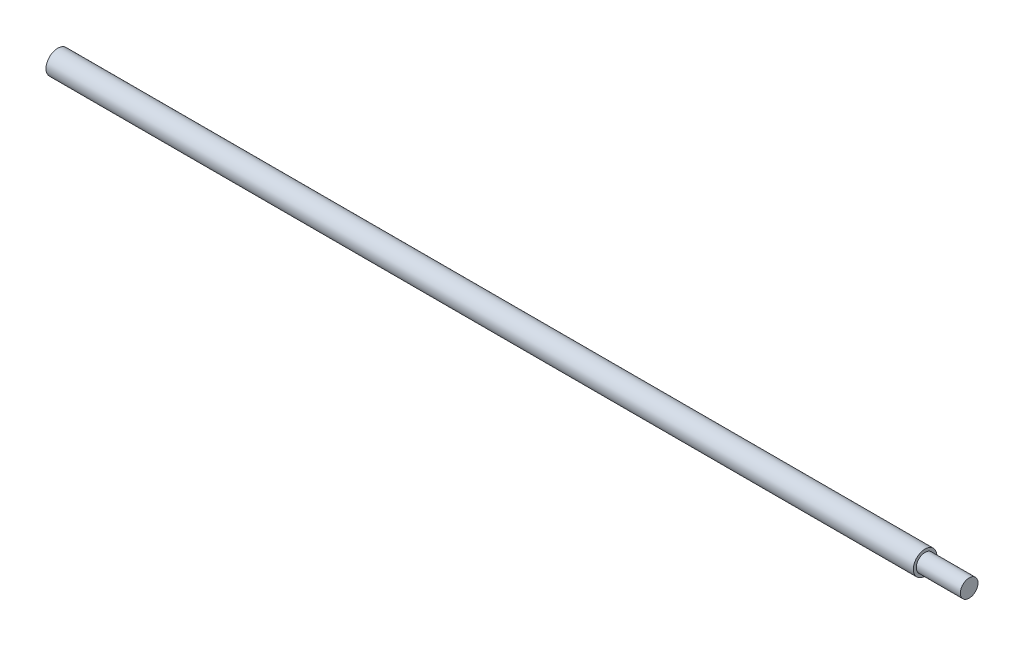
ISO-10303-21;
HEADER;
FILE_DESCRIPTION(('STEP AP214'),'2;1');
FILE_NAME('part.step','',(''),(''),'','','');
FILE_SCHEMA(('AUTOMOTIVE_DESIGN { 1 0 10303 214 1 1 1 1 }'));
ENDSEC;
DATA;
#1=APPLICATION_CONTEXT('core data for automotive mechanical design processes');
#2=APPLICATION_PROTOCOL_DEFINITION('international standard','automotive_design',2000,#1);
#3=PRODUCT_CONTEXT('',#1,'mechanical');
#4=PRODUCT('Part','Part','',(#3));
#5=PRODUCT_RELATED_PRODUCT_CATEGORY('part','',(#4));
#6=PRODUCT_DEFINITION_FORMATION('','',#4);
#7=PRODUCT_DEFINITION_CONTEXT('part definition',#1,'design');
#8=PRODUCT_DEFINITION('design','',#6,#7);
#9=PRODUCT_DEFINITION_SHAPE('','',#8);
#10=(LENGTH_UNIT() NAMED_UNIT(*) SI_UNIT(.MILLI.,.METRE.));
#11=(NAMED_UNIT(*) PLANE_ANGLE_UNIT() SI_UNIT($,.RADIAN.));
#12=(NAMED_UNIT(*) SI_UNIT($,.STERADIAN.) SOLID_ANGLE_UNIT());
#13=UNCERTAINTY_MEASURE_WITH_UNIT(LENGTH_MEASURE(1.E-05),#10,'distance_accuracy_value','');
#14=(GEOMETRIC_REPRESENTATION_CONTEXT(3) GLOBAL_UNCERTAINTY_ASSIGNED_CONTEXT((#13)) GLOBAL_UNIT_ASSIGNED_CONTEXT((#10,
#11,#12)) REPRESENTATION_CONTEXT('',''));
#15=CARTESIAN_POINT('',(0.,0.,0.));
#16=DIRECTION('',(0.,0.,1.));
#17=DIRECTION('',(1.,0.,0.));
#18=AXIS2_PLACEMENT_3D('',#15,#16,#17);
#19=CARTESIAN_POINT('',(-155.,0.,0.));
#20=DIRECTION('',(-1.,0.,0.));
#21=DIRECTION('',(0.,0.,1.));
#22=AXIS2_PLACEMENT_3D('',#19,#20,#21);
#23=PLANE('',#22);
#24=CARTESIAN_POINT('',(-155.,0.,0.));
#25=DIRECTION('',(1.,0.,0.));
#26=DIRECTION('',(0.,0.,-1.));
#27=AXIS2_PLACEMENT_3D('',#24,#25,#26);
#28=CIRCLE('',#27,3.99999999999995);
#29=CARTESIAN_POINT('',(-155.,0.,-3.99999999999995));
#30=VERTEX_POINT('',#29);
#31=EDGE_CURVE('E10',#30,#30,#28,.T.);
#32=ORIENTED_EDGE('',*,*,#31,.F.);
#33=EDGE_LOOP('',(#32));
#34=FACE_BOUND('',#33,.T.);
#35=ADVANCED_FACE('F39',(#34),#23,.T.);
#36=CARTESIAN_POINT('',(277.081919690945,0.,0.));
#37=DIRECTION('',(1.,0.,0.));
#38=DIRECTION('',(0.,0.,-1.));
#39=AXIS2_PLACEMENT_3D('',#36,#37,#38);
#40=CYLINDRICAL_SURFACE('',#39,3.99999999999995);
#41=ORIENTED_EDGE('',*,*,#31,.T.);
#42=EDGE_LOOP('',(#41));
#43=FACE_BOUND('',#42,.T.);
#44=CARTESIAN_POINT('',(140.,0.,0.));
#45=DIRECTION('',(1.,0.,0.));
#46=DIRECTION('',(0.,0.,-1.));
#47=AXIS2_PLACEMENT_3D('',#44,#45,#46);
#48=CIRCLE('',#47,3.99999999999995);
#49=CARTESIAN_POINT('',(140.,0.,-3.99999999999995));
#50=VERTEX_POINT('',#49);
#51=EDGE_CURVE('E45',#50,#50,#48,.T.);
#52=ORIENTED_EDGE('',*,*,#51,.F.);
#53=EDGE_LOOP('',(#52));
#54=FACE_BOUND('',#53,.T.);
#55=ADVANCED_FACE('F71',(#43,#54),#40,.T.);
#56=CARTESIAN_POINT('',(140.,3.99999999999995,0.));
#57=DIRECTION('',(1.,0.,0.));
#58=DIRECTION('',(0.,0.,-1.));
#59=AXIS2_PLACEMENT_3D('',#56,#57,#58);
#60=PLANE('',#59);
#61=ORIENTED_EDGE('',*,*,#51,.T.);
#62=EDGE_LOOP('',(#61));
#63=FACE_BOUND('',#62,.T.);
#64=CARTESIAN_POINT('',(140.,0.,0.));
#65=DIRECTION('',(1.,0.,0.));
#66=DIRECTION('',(0.,0.,-1.));
#67=AXIS2_PLACEMENT_3D('',#64,#65,#66);
#68=CIRCLE('',#67,2.99999999999998);
#69=CARTESIAN_POINT('',(140.,0.,-2.99999999999998));
#70=VERTEX_POINT('',#69);
#71=EDGE_CURVE('E49',#70,#70,#68,.T.);
#72=ORIENTED_EDGE('',*,*,#71,.F.);
#73=EDGE_LOOP('',(#72));
#74=FACE_BOUND('',#73,.T.);
#75=ADVANCED_FACE('F63',(#63,#74),#60,.T.);
#76=CARTESIAN_POINT('',(277.081919690945,0.,0.));
#77=DIRECTION('',(1.,0.,0.));
#78=DIRECTION('',(0.,0.,-1.));
#79=AXIS2_PLACEMENT_3D('',#76,#77,#78);
#80=CYLINDRICAL_SURFACE('',#79,2.99999999999998);
#81=ORIENTED_EDGE('',*,*,#71,.T.);
#82=EDGE_LOOP('',(#81));
#83=FACE_BOUND('',#82,.T.);
#84=CARTESIAN_POINT('',(155.,0.,0.));
#85=DIRECTION('',(1.,0.,0.));
#86=DIRECTION('',(0.,0.,-1.));
#87=AXIS2_PLACEMENT_3D('',#84,#85,#86);
#88=CIRCLE('',#87,2.99999999999998);
#89=CARTESIAN_POINT('',(155.,0.,-2.99999999999998));
#90=VERTEX_POINT('',#89);
#91=EDGE_CURVE('E53',#90,#90,#88,.T.);
#92=ORIENTED_EDGE('',*,*,#91,.F.);
#93=EDGE_LOOP('',(#92));
#94=FACE_BOUND('',#93,.T.);
#95=ADVANCED_FACE('F61',(#83,#94),#80,.T.);
#96=CARTESIAN_POINT('',(155.,2.99999999999998,0.));
#97=DIRECTION('',(1.,0.,0.));
#98=DIRECTION('',(0.,0.,-1.));
#99=AXIS2_PLACEMENT_3D('',#96,#97,#98);
#100=PLANE('',#99);
#101=ORIENTED_EDGE('',*,*,#91,.T.);
#102=EDGE_LOOP('',(#101));
#103=FACE_BOUND('',#102,.T.);
#104=ADVANCED_FACE('F59',(#103),#100,.T.);
#105=CLOSED_SHELL('',(#35,#55,#75,#95,#104));
#106=MANIFOLD_SOLID_BREP('B2',#105);
#107=ADVANCED_BREP_SHAPE_REPRESENTATION('',(#18,#106),#14);
#108=SHAPE_DEFINITION_REPRESENTATION(#9,#107);
ENDSEC;
END-ISO-10303-21;
